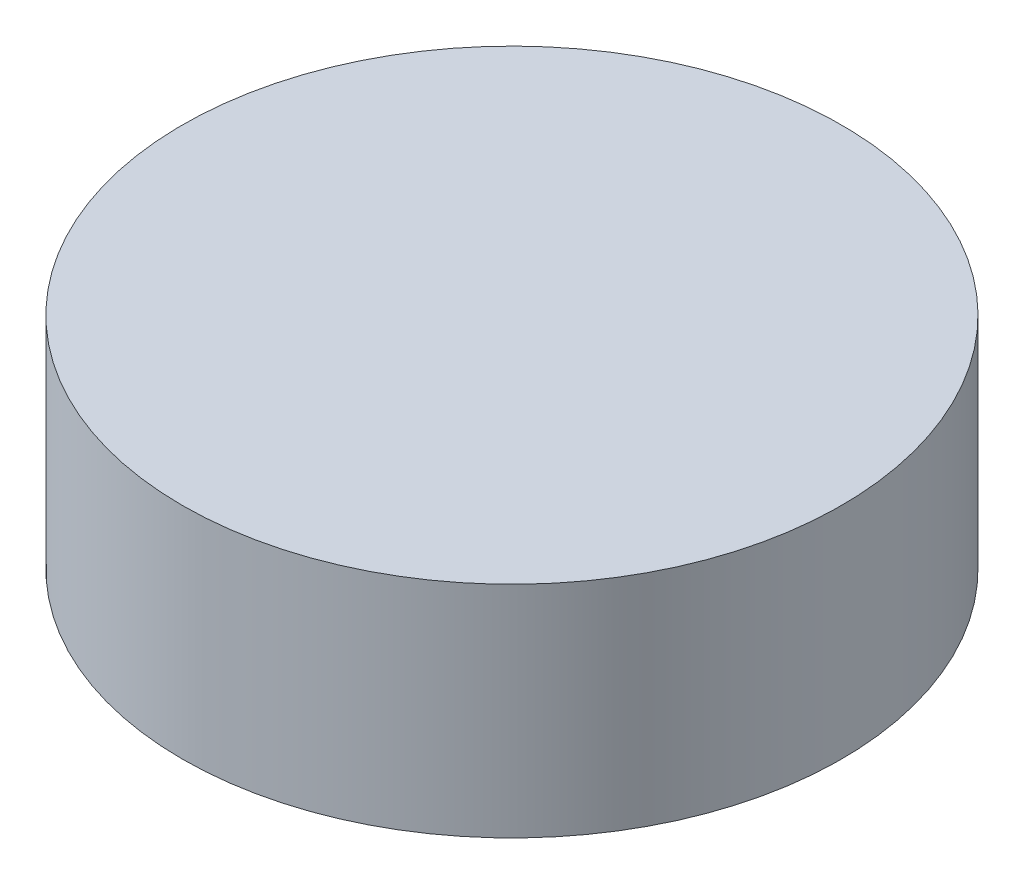
ISO-10303-21;
HEADER;
FILE_DESCRIPTION(('STEP AP214'),'2;1');
FILE_NAME('part.step','',(''),(''),'','','');
FILE_SCHEMA(('AUTOMOTIVE_DESIGN { 1 0 10303 214 1 1 1 1 }'));
ENDSEC;
DATA;
#1=APPLICATION_CONTEXT('core data for automotive mechanical design processes');
#2=APPLICATION_PROTOCOL_DEFINITION('international standard','automotive_design',2000,#1);
#3=PRODUCT_CONTEXT('',#1,'mechanical');
#4=PRODUCT('Part','Part','',(#3));
#5=PRODUCT_RELATED_PRODUCT_CATEGORY('part','',(#4));
#6=PRODUCT_DEFINITION_FORMATION('','',#4);
#7=PRODUCT_DEFINITION_CONTEXT('part definition',#1,'design');
#8=PRODUCT_DEFINITION('design','',#6,#7);
#9=PRODUCT_DEFINITION_SHAPE('','',#8);
#10=(LENGTH_UNIT() NAMED_UNIT(*) SI_UNIT(.MILLI.,.METRE.));
#11=(NAMED_UNIT(*) PLANE_ANGLE_UNIT() SI_UNIT($,.RADIAN.));
#12=(NAMED_UNIT(*) SI_UNIT($,.STERADIAN.) SOLID_ANGLE_UNIT());
#13=UNCERTAINTY_MEASURE_WITH_UNIT(LENGTH_MEASURE(1.E-05),#10,'distance_accuracy_value','');
#14=(GEOMETRIC_REPRESENTATION_CONTEXT(3) GLOBAL_UNCERTAINTY_ASSIGNED_CONTEXT((#13)) GLOBAL_UNIT_ASSIGNED_CONTEXT((#10,
#11,#12)) REPRESENTATION_CONTEXT('',''));
#15=CARTESIAN_POINT('',(0.,0.,0.));
#16=DIRECTION('',(0.,0.,1.));
#17=DIRECTION('',(1.,0.,0.));
#18=AXIS2_PLACEMENT_3D('',#15,#16,#17);
#19=CARTESIAN_POINT('',(0.,2.,0.));
#20=DIRECTION('',(0.,-1.,0.));
#21=DIRECTION('',(0.,0.,-1.));
#22=AXIS2_PLACEMENT_3D('',#19,#20,#21);
#23=CYLINDRICAL_SURFACE('',#22,3.);
#24=CARTESIAN_POINT('',(0.,2.,0.));
#25=DIRECTION('',(0.,1.,0.));
#26=DIRECTION('',(0.,0.,1.));
#27=AXIS2_PLACEMENT_3D('',#24,#25,#26);
#28=CIRCLE('',#27,3.);
#29=CARTESIAN_POINT('',(0.,2.,3.));
#30=VERTEX_POINT('',#29);
#31=EDGE_CURVE('E10',#30,#30,#28,.T.);
#32=ORIENTED_EDGE('',*,*,#31,.F.);
#33=EDGE_LOOP('',(#32));
#34=FACE_BOUND('',#33,.T.);
#35=CARTESIAN_POINT('',(0.,0.,0.));
#36=DIRECTION('',(0.,1.,0.));
#37=DIRECTION('',(0.,0.,1.));
#38=AXIS2_PLACEMENT_3D('',#35,#36,#37);
#39=CIRCLE('',#38,3.);
#40=CARTESIAN_POINT('',(0.,0.,3.));
#41=VERTEX_POINT('',#40);
#42=EDGE_CURVE('E45',#41,#41,#39,.T.);
#43=ORIENTED_EDGE('',*,*,#42,.T.);
#44=EDGE_LOOP('',(#43));
#45=FACE_BOUND('',#44,.T.);
#46=ADVANCED_FACE('F39',(#34,#45),#23,.T.);
#47=CARTESIAN_POINT('',(0.,2.,0.));
#48=DIRECTION('',(0.,1.,0.));
#49=DIRECTION('',(0.,0.,1.));
#50=AXIS2_PLACEMENT_3D('',#47,#48,#49);
#51=PLANE('',#50);
#52=ORIENTED_EDGE('',*,*,#31,.T.);
#53=EDGE_LOOP('',(#52));
#54=FACE_BOUND('',#53,.T.);
#55=ADVANCED_FACE('F53',(#54),#51,.T.);
#56=CARTESIAN_POINT('',(0.,0.,0.));
#57=DIRECTION('',(0.,1.,0.));
#58=DIRECTION('',(0.,0.,1.));
#59=AXIS2_PLACEMENT_3D('',#56,#57,#58);
#60=PLANE('',#59);
#61=ORIENTED_EDGE('',*,*,#42,.F.);
#62=EDGE_LOOP('',(#61));
#63=FACE_BOUND('',#62,.T.);
#64=ADVANCED_FACE('F55',(#63),#60,.F.);
#65=CLOSED_SHELL('',(#46,#55,#64));
#66=MANIFOLD_SOLID_BREP('B2',#65);
#67=ADVANCED_BREP_SHAPE_REPRESENTATION('',(#18,#66),#14);
#68=SHAPE_DEFINITION_REPRESENTATION(#9,#67);
ENDSEC;
END-ISO-10303-21;
